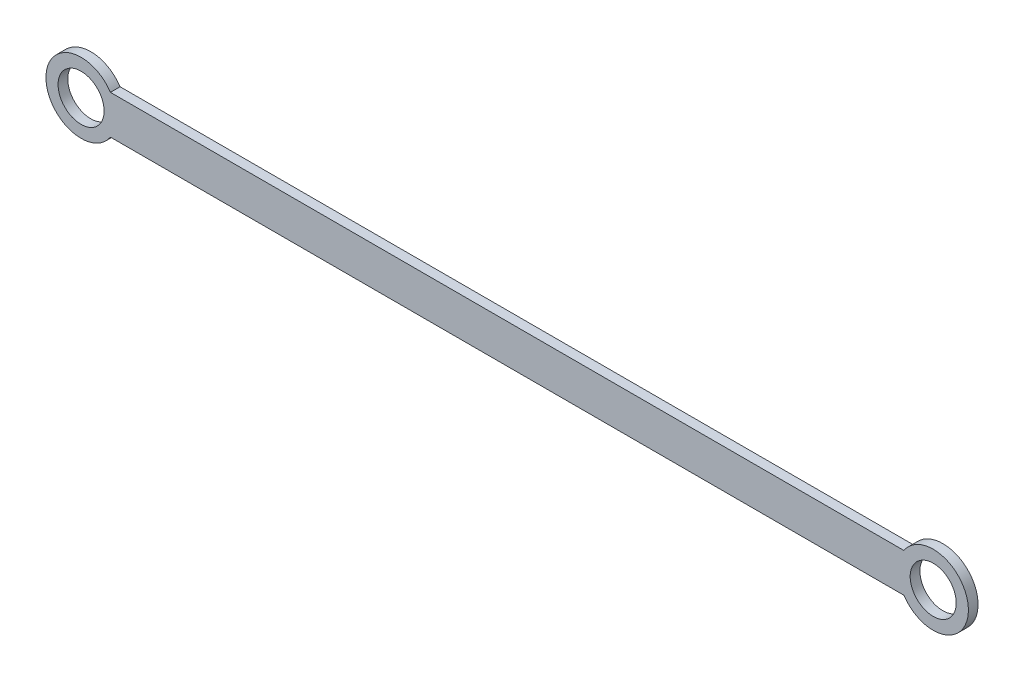
ISO-10303-21;
HEADER;
FILE_DESCRIPTION(('STEP AP214'),'2;1');
FILE_NAME('part.step','',(''),(''),'','','');
FILE_SCHEMA(('AUTOMOTIVE_DESIGN { 1 0 10303 214 1 1 1 1 }'));
ENDSEC;
DATA;
#1=APPLICATION_CONTEXT('core data for automotive mechanical design processes');
#2=APPLICATION_PROTOCOL_DEFINITION('international standard','automotive_design',2000,#1);
#3=PRODUCT_CONTEXT('',#1,'mechanical');
#4=PRODUCT('Part','Part','',(#3));
#5=PRODUCT_RELATED_PRODUCT_CATEGORY('part','',(#4));
#6=PRODUCT_DEFINITION_FORMATION('','',#4);
#7=PRODUCT_DEFINITION_CONTEXT('part definition',#1,'design');
#8=PRODUCT_DEFINITION('design','',#6,#7);
#9=PRODUCT_DEFINITION_SHAPE('','',#8);
#10=(LENGTH_UNIT() NAMED_UNIT(*) SI_UNIT(.MILLI.,.METRE.));
#11=(NAMED_UNIT(*) PLANE_ANGLE_UNIT() SI_UNIT($,.RADIAN.));
#12=(NAMED_UNIT(*) SI_UNIT($,.STERADIAN.) SOLID_ANGLE_UNIT());
#13=UNCERTAINTY_MEASURE_WITH_UNIT(LENGTH_MEASURE(1.E-05),#10,'distance_accuracy_value','');
#14=(GEOMETRIC_REPRESENTATION_CONTEXT(3) GLOBAL_UNCERTAINTY_ASSIGNED_CONTEXT((#13)) GLOBAL_UNIT_ASSIGNED_CONTEXT((#10,
#11,#12)) REPRESENTATION_CONTEXT('',''));
#15=CARTESIAN_POINT('',(0.,0.,0.));
#16=DIRECTION('',(0.,0.,1.));
#17=DIRECTION('',(1.,0.,0.));
#18=AXIS2_PLACEMENT_3D('',#15,#16,#17);
#19=CARTESIAN_POINT('',(0.,0.,4.));
#20=DIRECTION('',(0.,0.,-1.));
#21=DIRECTION('',(-1.,0.,0.));
#22=AXIS2_PLACEMENT_3D('',#19,#20,#21);
#23=PLANE('',#22);
#24=CARTESIAN_POINT('',(0.,0.,4.));
#25=DIRECTION('',(0.,0.,1.));
#26=DIRECTION('',(-1.,0.,0.));
#27=AXIS2_PLACEMENT_3D('',#24,#25,#26);
#28=CIRCLE('',#27,14.5);
#29=CARTESIAN_POINT('',(12.0933866224478,8.,4.));
#30=VERTEX_POINT('',#29);
#31=CARTESIAN_POINT('',(12.0933866224478,-8.,4.));
#32=VERTEX_POINT('',#31);
#33=EDGE_CURVE('E92',#30,#32,#28,.T.);
#34=ORIENTED_EDGE('',*,*,#33,.T.);
#35=DIRECTION('',(1.,0.,0.));
#36=VECTOR('',#35,1.);
#37=CARTESIAN_POINT('',(12.0933866224478,-8.,4.));
#38=LINE('',#37,#36);
#39=CARTESIAN_POINT('',(339.397537140577,-8.,4.));
#40=VERTEX_POINT('',#39);
#41=EDGE_CURVE('E87',#32,#40,#38,.T.);
#42=ORIENTED_EDGE('',*,*,#41,.T.);
#43=CARTESIAN_POINT('',(351.490923763025,-1.79362018808455E-13,4.));
#44=DIRECTION('',(0.,0.,1.));
#45=DIRECTION('',(-1.,0.,0.));
#46=AXIS2_PLACEMENT_3D('',#43,#44,#45);
#47=CIRCLE('',#46,14.4999999999999);
#48=CARTESIAN_POINT('',(339.397537140577,7.99999999999993,4.));
#49=VERTEX_POINT('',#48);
#50=EDGE_CURVE('E90',#40,#49,#47,.T.);
#51=ORIENTED_EDGE('',*,*,#50,.T.);
#52=DIRECTION('',(-1.,0.,0.));
#53=VECTOR('',#52,1.);
#54=CARTESIAN_POINT('',(12.0933866224478,8.,4.));
#55=LINE('',#54,#53);
#56=EDGE_CURVE('E57',#49,#30,#55,.T.);
#57=ORIENTED_EDGE('',*,*,#56,.T.);
#58=EDGE_LOOP('',(#34,#42,#51,#57));
#59=FACE_BOUND('',#58,.T.);
#60=CARTESIAN_POINT('',(0.,0.,4.));
#61=DIRECTION('',(0.,0.,1.));
#62=DIRECTION('',(1.,0.,0.));
#63=AXIS2_PLACEMENT_3D('',#60,#61,#62);
#64=CIRCLE('',#63,9.5);
#65=CARTESIAN_POINT('',(9.5,0.,4.));
#66=VERTEX_POINT('',#65);
#67=EDGE_CURVE('E112',#66,#66,#64,.T.);
#68=ORIENTED_EDGE('',*,*,#67,.F.);
#69=EDGE_LOOP('',(#68));
#70=FACE_BOUND('',#69,.T.);
#71=CARTESIAN_POINT('',(351.490923763025,0.,4.));
#72=DIRECTION('',(0.,0.,1.));
#73=DIRECTION('',(1.,0.,0.));
#74=AXIS2_PLACEMENT_3D('',#71,#72,#73);
#75=CIRCLE('',#74,9.50000000000001);
#76=CARTESIAN_POINT('',(360.990923763025,0.,4.));
#77=VERTEX_POINT('',#76);
#78=EDGE_CURVE('E134',#77,#77,#75,.T.);
#79=ORIENTED_EDGE('',*,*,#78,.F.);
#80=EDGE_LOOP('',(#79));
#81=FACE_BOUND('',#80,.T.);
#82=ADVANCED_FACE('F39',(#59,#70,#81),#23,.F.);
#83=CARTESIAN_POINT('',(0.,0.,0.));
#84=DIRECTION('',(0.,0.,-1.));
#85=DIRECTION('',(-1.,0.,0.));
#86=AXIS2_PLACEMENT_3D('',#83,#84,#85);
#87=PLANE('',#86);
#88=CARTESIAN_POINT('',(0.,0.,0.));
#89=DIRECTION('',(0.,0.,1.));
#90=DIRECTION('',(1.,0.,0.));
#91=AXIS2_PLACEMENT_3D('',#88,#89,#90);
#92=CIRCLE('',#91,9.5);
#93=CARTESIAN_POINT('',(9.5,0.,0.));
#94=VERTEX_POINT('',#93);
#95=EDGE_CURVE('E130',#94,#94,#92,.T.);
#96=ORIENTED_EDGE('',*,*,#95,.T.);
#97=EDGE_LOOP('',(#96));
#98=FACE_BOUND('',#97,.T.);
#99=CARTESIAN_POINT('',(0.,0.,0.));
#100=DIRECTION('',(0.,0.,1.));
#101=DIRECTION('',(-1.,0.,0.));
#102=AXIS2_PLACEMENT_3D('',#99,#100,#101);
#103=CIRCLE('',#102,14.5);
#104=CARTESIAN_POINT('',(12.0933866224478,8.,0.));
#105=VERTEX_POINT('',#104);
#106=CARTESIAN_POINT('',(12.0933866224478,-8.,0.));
#107=VERTEX_POINT('',#106);
#108=EDGE_CURVE('E108',#105,#107,#103,.T.);
#109=ORIENTED_EDGE('',*,*,#108,.F.);
#110=DIRECTION('',(-1.,0.,0.));
#111=VECTOR('',#110,1.);
#112=CARTESIAN_POINT('',(12.0933866224478,8.,0.));
#113=LINE('',#112,#111);
#114=CARTESIAN_POINT('',(339.397537140577,7.99999999999993,0.));
#115=VERTEX_POINT('',#114);
#116=EDGE_CURVE('E80',#115,#105,#113,.T.);
#117=ORIENTED_EDGE('',*,*,#116,.F.);
#118=CARTESIAN_POINT('',(351.490923763025,-1.79362018808455E-13,0.));
#119=DIRECTION('',(0.,0.,1.));
#120=DIRECTION('',(-1.,0.,0.));
#121=AXIS2_PLACEMENT_3D('',#118,#119,#120);
#122=CIRCLE('',#121,14.4999999999999);
#123=CARTESIAN_POINT('',(339.397537140577,-8.,0.));
#124=VERTEX_POINT('',#123);
#125=EDGE_CURVE('E74',#124,#115,#122,.T.);
#126=ORIENTED_EDGE('',*,*,#125,.F.);
#127=DIRECTION('',(1.,0.,0.));
#128=VECTOR('',#127,1.);
#129=CARTESIAN_POINT('',(12.0933866224478,-8.,0.));
#130=LINE('',#129,#128);
#131=EDGE_CURVE('E97',#107,#124,#130,.T.);
#132=ORIENTED_EDGE('',*,*,#131,.F.);
#133=EDGE_LOOP('',(#109,#117,#126,#132));
#134=FACE_BOUND('',#133,.T.);
#135=CARTESIAN_POINT('',(351.490923763025,0.,0.));
#136=DIRECTION('',(0.,0.,1.));
#137=DIRECTION('',(1.,0.,0.));
#138=AXIS2_PLACEMENT_3D('',#135,#136,#137);
#139=CIRCLE('',#138,9.50000000000001);
#140=CARTESIAN_POINT('',(360.990923763025,0.,0.));
#141=VERTEX_POINT('',#140);
#142=EDGE_CURVE('E138',#141,#141,#139,.T.);
#143=ORIENTED_EDGE('',*,*,#142,.T.);
#144=EDGE_LOOP('',(#143));
#145=FACE_BOUND('',#144,.T.);
#146=ADVANCED_FACE('F125',(#98,#134,#145),#87,.T.);
#147=CARTESIAN_POINT('',(0.,0.,4.));
#148=DIRECTION('',(0.,0.,-1.));
#149=DIRECTION('',(-1.,0.,0.));
#150=AXIS2_PLACEMENT_3D('',#147,#148,#149);
#151=CYLINDRICAL_SURFACE('',#150,14.5);
#152=ORIENTED_EDGE('',*,*,#108,.T.);
#153=DIRECTION('',(0.,0.,-1.));
#154=VECTOR('',#153,1.);
#155=CARTESIAN_POINT('',(12.0933866224478,-8.,4.));
#156=LINE('',#155,#154);
#157=EDGE_CURVE('E11',#32,#107,#156,.T.);
#158=ORIENTED_EDGE('',*,*,#157,.F.);
#159=ORIENTED_EDGE('',*,*,#33,.F.);
#160=DIRECTION('',(0.,0.,-1.));
#161=VECTOR('',#160,1.);
#162=CARTESIAN_POINT('',(12.0933866224478,8.,4.));
#163=LINE('',#162,#161);
#164=EDGE_CURVE('E104',#30,#105,#163,.T.);
#165=ORIENTED_EDGE('',*,*,#164,.T.);
#166=EDGE_LOOP('',(#152,#158,#159,#165));
#167=FACE_BOUND('',#166,.T.);
#168=ADVANCED_FACE('F41',(#167),#151,.T.);
#169=CARTESIAN_POINT('',(12.0933866224478,-8.,4.));
#170=DIRECTION('',(0.,1.,0.));
#171=DIRECTION('',(0.,0.,1.));
#172=AXIS2_PLACEMENT_3D('',#169,#170,#171);
#173=PLANE('',#172);
#174=ORIENTED_EDGE('',*,*,#131,.T.);
#175=DIRECTION('',(0.,0.,-1.));
#176=VECTOR('',#175,1.);
#177=CARTESIAN_POINT('',(339.397537140577,-8.,4.));
#178=LINE('',#177,#176);
#179=EDGE_CURVE('E49',#40,#124,#178,.T.);
#180=ORIENTED_EDGE('',*,*,#179,.F.);
#181=ORIENTED_EDGE('',*,*,#41,.F.);
#182=ORIENTED_EDGE('',*,*,#157,.T.);
#183=EDGE_LOOP('',(#174,#180,#181,#182));
#184=FACE_BOUND('',#183,.T.);
#185=ADVANCED_FACE('F96',(#184),#173,.F.);
#186=CARTESIAN_POINT('',(351.490923763025,-1.79362018808455E-13,4.));
#187=DIRECTION('',(0.,0.,-1.));
#188=DIRECTION('',(-1.,0.,0.));
#189=AXIS2_PLACEMENT_3D('',#186,#187,#188);
#190=CYLINDRICAL_SURFACE('',#189,14.4999999999999);
#191=ORIENTED_EDGE('',*,*,#125,.T.);
#192=DIRECTION('',(0.,0.,-1.));
#193=VECTOR('',#192,1.);
#194=CARTESIAN_POINT('',(339.397537140577,7.99999999999993,4.));
#195=LINE('',#194,#193);
#196=EDGE_CURVE('E99',#49,#115,#195,.T.);
#197=ORIENTED_EDGE('',*,*,#196,.F.);
#198=ORIENTED_EDGE('',*,*,#50,.F.);
#199=ORIENTED_EDGE('',*,*,#179,.T.);
#200=EDGE_LOOP('',(#191,#197,#198,#199));
#201=FACE_BOUND('',#200,.T.);
#202=ADVANCED_FACE('F100',(#201),#190,.T.);
#203=CARTESIAN_POINT('',(12.0933866224478,8.,4.));
#204=DIRECTION('',(0.,-1.,0.));
#205=DIRECTION('',(0.,0.,-1.));
#206=AXIS2_PLACEMENT_3D('',#203,#204,#205);
#207=PLANE('',#206);
#208=ORIENTED_EDGE('',*,*,#116,.T.);
#209=ORIENTED_EDGE('',*,*,#164,.F.);
#210=ORIENTED_EDGE('',*,*,#56,.F.);
#211=ORIENTED_EDGE('',*,*,#196,.T.);
#212=EDGE_LOOP('',(#208,#209,#210,#211));
#213=FACE_BOUND('',#212,.T.);
#214=ADVANCED_FACE('F122',(#213),#207,.F.);
#215=CARTESIAN_POINT('',(0.,0.,4.));
#216=DIRECTION('',(0.,0.,-1.));
#217=DIRECTION('',(-1.,0.,0.));
#218=AXIS2_PLACEMENT_3D('',#215,#216,#217);
#219=CYLINDRICAL_SURFACE('',#218,9.5);
#220=ORIENTED_EDGE('',*,*,#67,.T.);
#221=EDGE_LOOP('',(#220));
#222=FACE_BOUND('',#221,.T.);
#223=ORIENTED_EDGE('',*,*,#95,.F.);
#224=EDGE_LOOP('',(#223));
#225=FACE_BOUND('',#224,.T.);
#226=ADVANCED_FACE('F157',(#222,#225),#219,.F.);
#227=CARTESIAN_POINT('',(351.490923763025,0.,4.));
#228=DIRECTION('',(0.,0.,-1.));
#229=DIRECTION('',(-1.,0.,0.));
#230=AXIS2_PLACEMENT_3D('',#227,#228,#229);
#231=CYLINDRICAL_SURFACE('',#230,9.50000000000001);
#232=ORIENTED_EDGE('',*,*,#78,.T.);
#233=EDGE_LOOP('',(#232));
#234=FACE_BOUND('',#233,.T.);
#235=ORIENTED_EDGE('',*,*,#142,.F.);
#236=EDGE_LOOP('',(#235));
#237=FACE_BOUND('',#236,.T.);
#238=ADVANCED_FACE('F146',(#234,#237),#231,.F.);
#239=CLOSED_SHELL('',(#82,#146,#168,#185,#202,#214,#226,#238));
#240=MANIFOLD_SOLID_BREP('B2',#239);
#241=ADVANCED_BREP_SHAPE_REPRESENTATION('',(#18,#240),#14);
#242=SHAPE_DEFINITION_REPRESENTATION(#9,#241);
ENDSEC;
END-ISO-10303-21;
